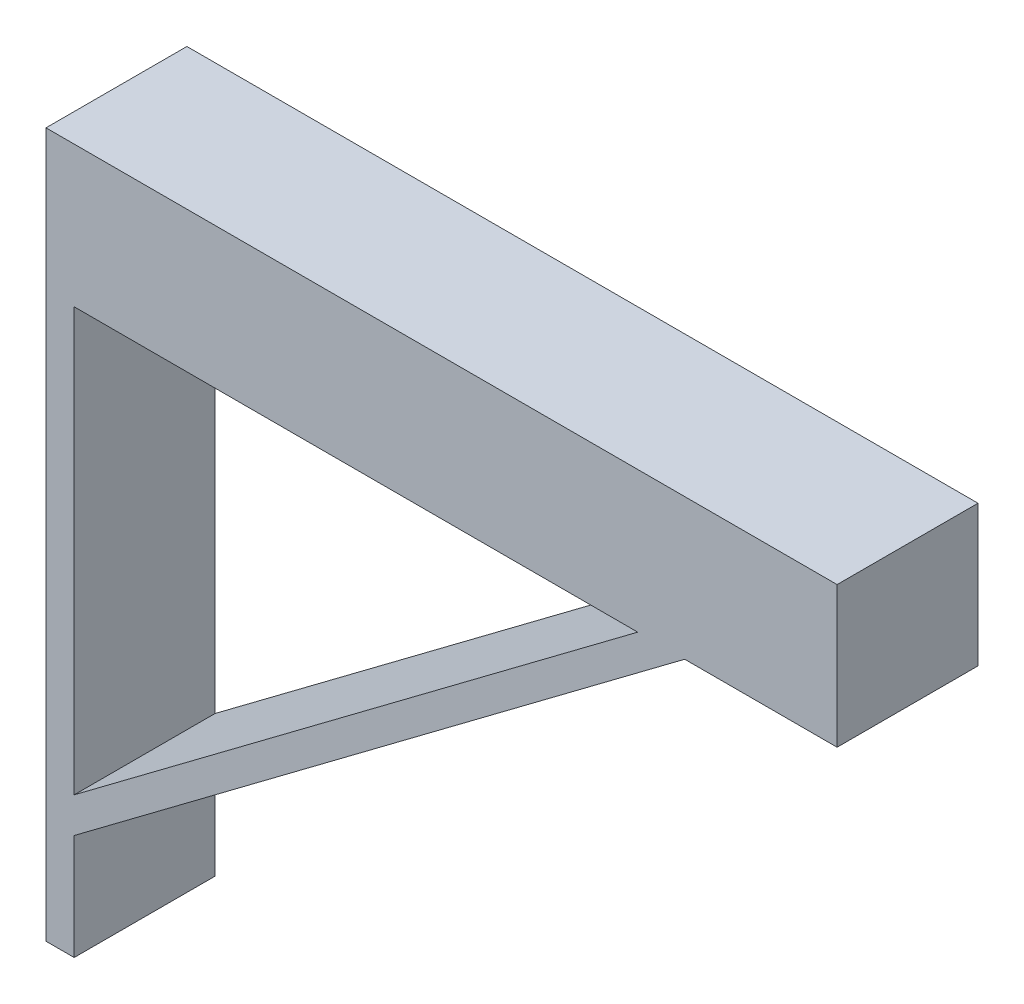
ISO-10303-21;
HEADER;
FILE_DESCRIPTION(('STEP AP214'),'2;1');
FILE_NAME('part.step','',(''),(''),'','','');
FILE_SCHEMA(('AUTOMOTIVE_DESIGN { 1 0 10303 214 1 1 1 1 }'));
ENDSEC;
DATA;
#1=APPLICATION_CONTEXT('core data for automotive mechanical design processes');
#2=APPLICATION_PROTOCOL_DEFINITION('international standard','automotive_design',2000,#1);
#3=PRODUCT_CONTEXT('',#1,'mechanical');
#4=PRODUCT('Part','Part','',(#3));
#5=PRODUCT_RELATED_PRODUCT_CATEGORY('part','',(#4));
#6=PRODUCT_DEFINITION_FORMATION('','',#4);
#7=PRODUCT_DEFINITION_CONTEXT('part definition',#1,'design');
#8=PRODUCT_DEFINITION('design','',#6,#7);
#9=PRODUCT_DEFINITION_SHAPE('','',#8);
#10=(LENGTH_UNIT() NAMED_UNIT(*) SI_UNIT(.MILLI.,.METRE.));
#11=(NAMED_UNIT(*) PLANE_ANGLE_UNIT() SI_UNIT($,.RADIAN.));
#12=(NAMED_UNIT(*) SI_UNIT($,.STERADIAN.) SOLID_ANGLE_UNIT());
#13=UNCERTAINTY_MEASURE_WITH_UNIT(LENGTH_MEASURE(1.E-05),#10,'distance_accuracy_value','');
#14=(GEOMETRIC_REPRESENTATION_CONTEXT(3) GLOBAL_UNCERTAINTY_ASSIGNED_CONTEXT((#13)) GLOBAL_UNIT_ASSIGNED_CONTEXT((#10,
#11,#12)) REPRESENTATION_CONTEXT('',''));
#15=CARTESIAN_POINT('',(0.,0.,0.));
#16=DIRECTION('',(0.,0.,1.));
#17=DIRECTION('',(1.,0.,0.));
#18=AXIS2_PLACEMENT_3D('',#15,#16,#17);
#19=CARTESIAN_POINT('',(8.88791208791208,-11.8505494505494,20.));
#20=DIRECTION('',(0.6,-0.8,0.));
#21=DIRECTION('',(0.8,0.6,0.));
#22=AXIS2_PLACEMENT_3D('',#19,#20,#21);
#23=PLANE('',#22);
#24=DIRECTION('',(-0.8,-0.6,0.));
#25=VECTOR('',#24,1.);
#26=CARTESIAN_POINT('',(8.88791208791208,-11.8505494505494,0.));
#27=LINE('',#26,#25);
#28=CARTESIAN_POINT('',(42.7106227106227,13.5164835164835,0.));
#29=VERTEX_POINT('',#28);
#30=CARTESIAN_POINT('',(-43.956043956044,-51.4835164835165,0.));
#31=VERTEX_POINT('',#30);
#32=EDGE_CURVE('E177',#29,#31,#27,.T.);
#33=ORIENTED_EDGE('',*,*,#32,.F.);
#34=DIRECTION('',(0.,0.,-1.));
#35=VECTOR('',#34,1.);
#36=CARTESIAN_POINT('',(42.7106227106227,13.5164835164835,20.));
#37=LINE('',#36,#35);
#38=CARTESIAN_POINT('',(42.7106227106227,13.5164835164835,20.));
#39=VERTEX_POINT('',#38);
#40=EDGE_CURVE('E11',#39,#29,#37,.T.);
#41=ORIENTED_EDGE('',*,*,#40,.F.);
#42=DIRECTION('',(-0.8,-0.6,0.));
#43=VECTOR('',#42,1.);
#44=CARTESIAN_POINT('',(8.88791208791208,-11.8505494505494,20.));
#45=LINE('',#44,#43);
#46=CARTESIAN_POINT('',(-43.956043956044,-51.4835164835165,20.));
#47=VERTEX_POINT('',#46);
#48=EDGE_CURVE('E194',#39,#47,#45,.T.);
#49=ORIENTED_EDGE('',*,*,#48,.T.);
#50=DIRECTION('',(0.,0.,-1.));
#51=VECTOR('',#50,1.);
#52=CARTESIAN_POINT('',(-43.956043956044,-51.4835164835165,20.));
#53=LINE('',#52,#51);
#54=EDGE_CURVE('E54',#47,#31,#53,.T.);
#55=ORIENTED_EDGE('',*,*,#54,.T.);
#56=EDGE_LOOP('',(#33,#41,#49,#55));
#57=FACE_BOUND('',#56,.T.);
#58=ADVANCED_FACE('F35',(#57),#23,.T.);
#59=CARTESIAN_POINT('',(0.,13.5164835164835,20.));
#60=DIRECTION('',(0.,1.,0.));
#61=DIRECTION('',(-1.,0.,0.));
#62=AXIS2_PLACEMENT_3D('',#59,#60,#61);
#63=PLANE('',#62);
#64=DIRECTION('',(1.,0.,0.));
#65=VECTOR('',#64,1.);
#66=CARTESIAN_POINT('',(0.,13.5164835164835,0.));
#67=LINE('',#66,#65);
#68=CARTESIAN_POINT('',(64.343956043956,13.5164835164835,0.));
#69=VERTEX_POINT('',#68);
#70=EDGE_CURVE('E174',#29,#69,#67,.T.);
#71=ORIENTED_EDGE('',*,*,#70,.T.);
#72=DIRECTION('',(0.,0.,-1.));
#73=VECTOR('',#72,1.);
#74=CARTESIAN_POINT('',(64.343956043956,13.5164835164835,20.));
#75=LINE('',#74,#73);
#76=CARTESIAN_POINT('',(64.343956043956,13.5164835164835,20.));
#77=VERTEX_POINT('',#76);
#78=EDGE_CURVE('E45',#77,#69,#75,.T.);
#79=ORIENTED_EDGE('',*,*,#78,.F.);
#80=DIRECTION('',(1.,0.,0.));
#81=VECTOR('',#80,1.);
#82=CARTESIAN_POINT('',(0.,13.5164835164835,20.));
#83=LINE('',#82,#81);
#84=EDGE_CURVE('E192',#39,#77,#83,.T.);
#85=ORIENTED_EDGE('',*,*,#84,.F.);
#86=ORIENTED_EDGE('',*,*,#40,.T.);
#87=EDGE_LOOP('',(#71,#79,#85,#86));
#88=FACE_BOUND('',#87,.T.);
#89=ADVANCED_FACE('F216',(#88),#63,.F.);
#90=CARTESIAN_POINT('',(64.343956043956,0.,20.));
#91=DIRECTION('',(1.,0.,0.));
#92=DIRECTION('',(0.,0.,-1.));
#93=AXIS2_PLACEMENT_3D('',#90,#91,#92);
#94=PLANE('',#93);
#95=DIRECTION('',(0.,-1.,0.));
#96=VECTOR('',#95,1.);
#97=CARTESIAN_POINT('',(64.343956043956,0.,0.));
#98=LINE('',#97,#96);
#99=CARTESIAN_POINT('',(64.343956043956,33.5164835164835,0.));
#100=VERTEX_POINT('',#99);
#101=EDGE_CURVE('E171',#100,#69,#98,.T.);
#102=ORIENTED_EDGE('',*,*,#101,.F.);
#103=DIRECTION('',(0.,0.,-1.));
#104=VECTOR('',#103,1.);
#105=CARTESIAN_POINT('',(64.343956043956,33.5164835164835,20.));
#106=LINE('',#105,#104);
#107=CARTESIAN_POINT('',(64.343956043956,33.5164835164835,20.));
#108=VERTEX_POINT('',#107);
#109=EDGE_CURVE('E144',#108,#100,#106,.T.);
#110=ORIENTED_EDGE('',*,*,#109,.F.);
#111=DIRECTION('',(0.,-1.,0.));
#112=VECTOR('',#111,1.);
#113=CARTESIAN_POINT('',(64.343956043956,0.,20.));
#114=LINE('',#113,#112);
#115=EDGE_CURVE('E189',#108,#77,#114,.T.);
#116=ORIENTED_EDGE('',*,*,#115,.T.);
#117=ORIENTED_EDGE('',*,*,#78,.T.);
#118=EDGE_LOOP('',(#102,#110,#116,#117));
#119=FACE_BOUND('',#118,.T.);
#120=ADVANCED_FACE('F221',(#119),#94,.T.);
#121=CARTESIAN_POINT('',(0.,33.5164835164835,20.));
#122=DIRECTION('',(0.,1.,0.));
#123=DIRECTION('',(0.,0.,1.));
#124=AXIS2_PLACEMENT_3D('',#121,#122,#123);
#125=PLANE('',#124);
#126=DIRECTION('',(1.,0.,0.));
#127=VECTOR('',#126,1.);
#128=CARTESIAN_POINT('',(0.,33.5164835164835,0.));
#129=LINE('',#128,#127);
#130=CARTESIAN_POINT('',(-47.956043956044,33.5164835164835,0.));
#131=VERTEX_POINT('',#130);
#132=EDGE_CURVE('E168',#131,#100,#129,.T.);
#133=ORIENTED_EDGE('',*,*,#132,.F.);
#134=DIRECTION('',(0.,0.,-1.));
#135=VECTOR('',#134,1.);
#136=CARTESIAN_POINT('',(-47.956043956044,33.5164835164835,20.));
#137=LINE('',#136,#135);
#138=CARTESIAN_POINT('',(-47.956043956044,33.5164835164835,20.));
#139=VERTEX_POINT('',#138);
#140=EDGE_CURVE('E142',#139,#131,#137,.T.);
#141=ORIENTED_EDGE('',*,*,#140,.F.);
#142=DIRECTION('',(1.,0.,0.));
#143=VECTOR('',#142,1.);
#144=CARTESIAN_POINT('',(0.,33.5164835164835,20.));
#145=LINE('',#144,#143);
#146=EDGE_CURVE('E136',#139,#108,#145,.T.);
#147=ORIENTED_EDGE('',*,*,#146,.T.);
#148=ORIENTED_EDGE('',*,*,#109,.T.);
#149=EDGE_LOOP('',(#133,#141,#147,#148));
#150=FACE_BOUND('',#149,.T.);
#151=ADVANCED_FACE('F227',(#150),#125,.T.);
#152=CARTESIAN_POINT('',(-47.956043956044,0.,20.));
#153=DIRECTION('',(1.,0.,0.));
#154=DIRECTION('',(0.,1.,0.));
#155=AXIS2_PLACEMENT_3D('',#152,#153,#154);
#156=PLANE('',#155);
#157=DIRECTION('',(0.,-1.,0.));
#158=VECTOR('',#157,1.);
#159=CARTESIAN_POINT('',(-47.956043956044,0.,0.));
#160=LINE('',#159,#158);
#161=CARTESIAN_POINT('',(-47.956043956044,-66.4835164835165,0.));
#162=VERTEX_POINT('',#161);
#163=EDGE_CURVE('E141',#131,#162,#160,.T.);
#164=ORIENTED_EDGE('',*,*,#163,.T.);
#165=DIRECTION('',(0.,0.,-1.));
#166=VECTOR('',#165,1.);
#167=CARTESIAN_POINT('',(-47.956043956044,-66.4835164835165,20.));
#168=LINE('',#167,#166);
#169=CARTESIAN_POINT('',(-47.956043956044,-66.4835164835165,20.));
#170=VERTEX_POINT('',#169);
#171=EDGE_CURVE('E123',#170,#162,#168,.T.);
#172=ORIENTED_EDGE('',*,*,#171,.F.);
#173=DIRECTION('',(0.,-1.,0.));
#174=VECTOR('',#173,1.);
#175=CARTESIAN_POINT('',(-47.956043956044,0.,20.));
#176=LINE('',#175,#174);
#177=EDGE_CURVE('E128',#139,#170,#176,.T.);
#178=ORIENTED_EDGE('',*,*,#177,.F.);
#179=ORIENTED_EDGE('',*,*,#140,.T.);
#180=EDGE_LOOP('',(#164,#172,#178,#179));
#181=FACE_BOUND('',#180,.T.);
#182=ADVANCED_FACE('F139',(#181),#156,.F.);
#183=CARTESIAN_POINT('',(-2.30661033618894E-13,-66.4835164835167,20.));
#184=DIRECTION('',(0.,1.,0.));
#185=DIRECTION('',(-1.,0.,0.));
#186=AXIS2_PLACEMENT_3D('',#183,#184,#185);
#187=PLANE('',#186);
#188=DIRECTION('',(1.,0.,0.));
#189=VECTOR('',#188,1.);
#190=CARTESIAN_POINT('',(-2.30661033618894E-13,-66.4835164835167,0.));
#191=LINE('',#190,#189);
#192=CARTESIAN_POINT('',(-43.956043956044,-66.4835164835165,0.));
#193=VERTEX_POINT('',#192);
#194=EDGE_CURVE('E165',#162,#193,#191,.T.);
#195=ORIENTED_EDGE('',*,*,#194,.T.);
#196=DIRECTION('',(0.,0.,-1.));
#197=VECTOR('',#196,1.);
#198=CARTESIAN_POINT('',(-43.956043956044,-66.4835164835165,20.));
#199=LINE('',#198,#197);
#200=CARTESIAN_POINT('',(-43.956043956044,-66.4835164835165,20.));
#201=VERTEX_POINT('',#200);
#202=EDGE_CURVE('E86',#201,#193,#199,.T.);
#203=ORIENTED_EDGE('',*,*,#202,.F.);
#204=DIRECTION('',(1.,0.,0.));
#205=VECTOR('',#204,1.);
#206=CARTESIAN_POINT('',(-2.30661033618894E-13,-66.4835164835167,20.));
#207=LINE('',#206,#205);
#208=EDGE_CURVE('E119',#170,#201,#207,.T.);
#209=ORIENTED_EDGE('',*,*,#208,.F.);
#210=ORIENTED_EDGE('',*,*,#171,.T.);
#211=EDGE_LOOP('',(#195,#203,#209,#210));
#212=FACE_BOUND('',#211,.T.);
#213=ADVANCED_FACE('F121',(#212),#187,.F.);
#214=CARTESIAN_POINT('',(-43.956043956044,0.,20.));
#215=DIRECTION('',(1.,0.,0.));
#216=DIRECTION('',(0.,0.,-1.));
#217=AXIS2_PLACEMENT_3D('',#214,#215,#216);
#218=PLANE('',#217);
#219=DIRECTION('',(0.,-1.,0.));
#220=VECTOR('',#219,1.);
#221=CARTESIAN_POINT('',(-43.956043956044,0.,0.));
#222=LINE('',#221,#220);
#223=CARTESIAN_POINT('',(-43.956043956044,13.5164835164835,0.));
#224=VERTEX_POINT('',#223);
#225=CARTESIAN_POINT('',(-43.956043956044,-46.4835164835165,0.));
#226=VERTEX_POINT('',#225);
#227=EDGE_CURVE('E184',#224,#226,#222,.T.);
#228=ORIENTED_EDGE('',*,*,#227,.F.);
#229=DIRECTION('',(0.,0.,-1.));
#230=VECTOR('',#229,1.);
#231=CARTESIAN_POINT('',(-43.956043956044,13.5164835164835,20.));
#232=LINE('',#231,#230);
#233=CARTESIAN_POINT('',(-43.956043956044,13.5164835164835,20.));
#234=VERTEX_POINT('',#233);
#235=EDGE_CURVE('E39',#234,#224,#232,.T.);
#236=ORIENTED_EDGE('',*,*,#235,.F.);
#237=DIRECTION('',(0.,-1.,0.));
#238=VECTOR('',#237,1.);
#239=CARTESIAN_POINT('',(-43.956043956044,0.,20.));
#240=LINE('',#239,#238);
#241=CARTESIAN_POINT('',(-43.956043956044,-46.4835164835165,20.));
#242=VERTEX_POINT('',#241);
#243=EDGE_CURVE('E164',#234,#242,#240,.T.);
#244=ORIENTED_EDGE('',*,*,#243,.T.);
#245=DIRECTION('',(0.,0.,-1.));
#246=VECTOR('',#245,1.);
#247=CARTESIAN_POINT('',(-43.956043956044,-46.4835164835165,20.));
#248=LINE('',#247,#246);
#249=EDGE_CURVE('E151',#242,#226,#248,.T.);
#250=ORIENTED_EDGE('',*,*,#249,.T.);
#251=EDGE_LOOP('',(#228,#236,#244,#250));
#252=FACE_BOUND('',#251,.T.);
#253=ADVANCED_FACE('F37',(#252),#218,.T.);
#254=CARTESIAN_POINT('',(0.,13.5164835164835,20.));
#255=DIRECTION('',(0.,1.,0.));
#256=DIRECTION('',(0.,0.,1.));
#257=AXIS2_PLACEMENT_3D('',#254,#255,#256);
#258=PLANE('',#257);
#259=DIRECTION('',(1.,0.,0.));
#260=VECTOR('',#259,1.);
#261=CARTESIAN_POINT('',(0.,13.5164835164835,0.));
#262=LINE('',#261,#260);
#263=CARTESIAN_POINT('',(36.043956043956,13.5164835164835,0.));
#264=VERTEX_POINT('',#263);
#265=EDGE_CURVE('E182',#224,#264,#262,.T.);
#266=ORIENTED_EDGE('',*,*,#265,.T.);
#267=DIRECTION('',(0.,0.,-1.));
#268=VECTOR('',#267,1.);
#269=CARTESIAN_POINT('',(36.043956043956,13.5164835164835,20.));
#270=LINE('',#269,#268);
#271=CARTESIAN_POINT('',(36.043956043956,13.5164835164835,20.));
#272=VERTEX_POINT('',#271);
#273=EDGE_CURVE('E152',#272,#264,#270,.T.);
#274=ORIENTED_EDGE('',*,*,#273,.F.);
#275=DIRECTION('',(1.,0.,0.));
#276=VECTOR('',#275,1.);
#277=CARTESIAN_POINT('',(0.,13.5164835164835,20.));
#278=LINE('',#277,#276);
#279=EDGE_CURVE('E198',#234,#272,#278,.T.);
#280=ORIENTED_EDGE('',*,*,#279,.F.);
#281=ORIENTED_EDGE('',*,*,#235,.T.);
#282=EDGE_LOOP('',(#266,#274,#280,#281));
#283=FACE_BOUND('',#282,.T.);
#284=ADVANCED_FACE('F207',(#283),#258,.F.);
#285=CARTESIAN_POINT('',(6.48791208791208,-8.65054945054943,20.));
#286=DIRECTION('',(-0.6,0.8,0.));
#287=DIRECTION('',(-0.8,-0.6,0.));
#288=AXIS2_PLACEMENT_3D('',#285,#286,#287);
#289=PLANE('',#288);
#290=DIRECTION('',(0.8,0.6,0.));
#291=VECTOR('',#290,1.);
#292=CARTESIAN_POINT('',(6.48791208791208,-8.65054945054943,0.));
#293=LINE('',#292,#291);
#294=EDGE_CURVE('E179',#226,#264,#293,.T.);
#295=ORIENTED_EDGE('',*,*,#294,.F.);
#296=ORIENTED_EDGE('',*,*,#249,.F.);
#297=DIRECTION('',(0.8,0.6,0.));
#298=VECTOR('',#297,1.);
#299=CARTESIAN_POINT('',(6.48791208791208,-8.65054945054943,20.));
#300=LINE('',#299,#298);
#301=EDGE_CURVE('E196',#242,#272,#300,.T.);
#302=ORIENTED_EDGE('',*,*,#301,.T.);
#303=ORIENTED_EDGE('',*,*,#273,.T.);
#304=EDGE_LOOP('',(#295,#296,#302,#303));
#305=FACE_BOUND('',#304,.T.);
#306=ADVANCED_FACE('F203',(#305),#289,.T.);
#307=CARTESIAN_POINT('',(-43.9560439560439,0.,20.));
#308=DIRECTION('',(1.,0.,0.));
#309=DIRECTION('',(0.,1.,0.));
#310=AXIS2_PLACEMENT_3D('',#307,#308,#309);
#311=PLANE('',#310);
#312=DIRECTION('',(0.,-1.,0.));
#313=VECTOR('',#312,1.);
#314=CARTESIAN_POINT('',(-43.9560439560439,0.,0.));
#315=LINE('',#314,#313);
#316=EDGE_CURVE('E161',#31,#193,#315,.T.);
#317=ORIENTED_EDGE('',*,*,#316,.F.);
#318=ORIENTED_EDGE('',*,*,#54,.F.);
#319=DIRECTION('',(0.,-1.,0.));
#320=VECTOR('',#319,1.);
#321=CARTESIAN_POINT('',(-43.9560439560439,0.,20.));
#322=LINE('',#321,#320);
#323=EDGE_CURVE('E127',#47,#201,#322,.T.);
#324=ORIENTED_EDGE('',*,*,#323,.T.);
#325=ORIENTED_EDGE('',*,*,#202,.T.);
#326=EDGE_LOOP('',(#317,#318,#324,#325));
#327=FACE_BOUND('',#326,.T.);
#328=ADVANCED_FACE('F213',(#327),#311,.T.);
#329=CARTESIAN_POINT('',(0.,0.,20.));
#330=DIRECTION('',(0.,0.,1.));
#331=DIRECTION('',(1.,0.,0.));
#332=AXIS2_PLACEMENT_3D('',#329,#330,#331);
#333=PLANE('',#332);
#334=ORIENTED_EDGE('',*,*,#243,.F.);
#335=ORIENTED_EDGE('',*,*,#279,.T.);
#336=ORIENTED_EDGE('',*,*,#301,.F.);
#337=EDGE_LOOP('',(#334,#335,#336));
#338=FACE_BOUND('',#337,.T.);
#339=ORIENTED_EDGE('',*,*,#48,.F.);
#340=ORIENTED_EDGE('',*,*,#84,.T.);
#341=ORIENTED_EDGE('',*,*,#115,.F.);
#342=ORIENTED_EDGE('',*,*,#146,.F.);
#343=ORIENTED_EDGE('',*,*,#177,.T.);
#344=ORIENTED_EDGE('',*,*,#208,.T.);
#345=ORIENTED_EDGE('',*,*,#323,.F.);
#346=EDGE_LOOP('',(#339,#340,#341,#342,#343,#344,#345));
#347=FACE_BOUND('',#346,.T.);
#348=ADVANCED_FACE('F133',(#338,#347),#333,.T.);
#349=CARTESIAN_POINT('',(0.,0.,0.));
#350=DIRECTION('',(0.,0.,1.));
#351=DIRECTION('',(1.,0.,0.));
#352=AXIS2_PLACEMENT_3D('',#349,#350,#351);
#353=PLANE('',#352);
#354=ORIENTED_EDGE('',*,*,#227,.T.);
#355=ORIENTED_EDGE('',*,*,#294,.T.);
#356=ORIENTED_EDGE('',*,*,#265,.F.);
#357=EDGE_LOOP('',(#354,#355,#356));
#358=FACE_BOUND('',#357,.T.);
#359=ORIENTED_EDGE('',*,*,#32,.T.);
#360=ORIENTED_EDGE('',*,*,#316,.T.);
#361=ORIENTED_EDGE('',*,*,#194,.F.);
#362=ORIENTED_EDGE('',*,*,#163,.F.);
#363=ORIENTED_EDGE('',*,*,#132,.T.);
#364=ORIENTED_EDGE('',*,*,#101,.T.);
#365=ORIENTED_EDGE('',*,*,#70,.F.);
#366=EDGE_LOOP('',(#359,#360,#361,#362,#363,#364,#365));
#367=FACE_BOUND('',#366,.T.);
#368=ADVANCED_FACE('F205',(#358,#367),#353,.F.);
#369=CLOSED_SHELL('',(#58,#89,#120,#151,#182,#213,#253,#284,#306,#328,#348,#368));
#370=MANIFOLD_SOLID_BREP('B2',#369);
#371=ADVANCED_BREP_SHAPE_REPRESENTATION('',(#18,#370),#14);
#372=SHAPE_DEFINITION_REPRESENTATION(#9,#371);
ENDSEC;
END-ISO-10303-21;
